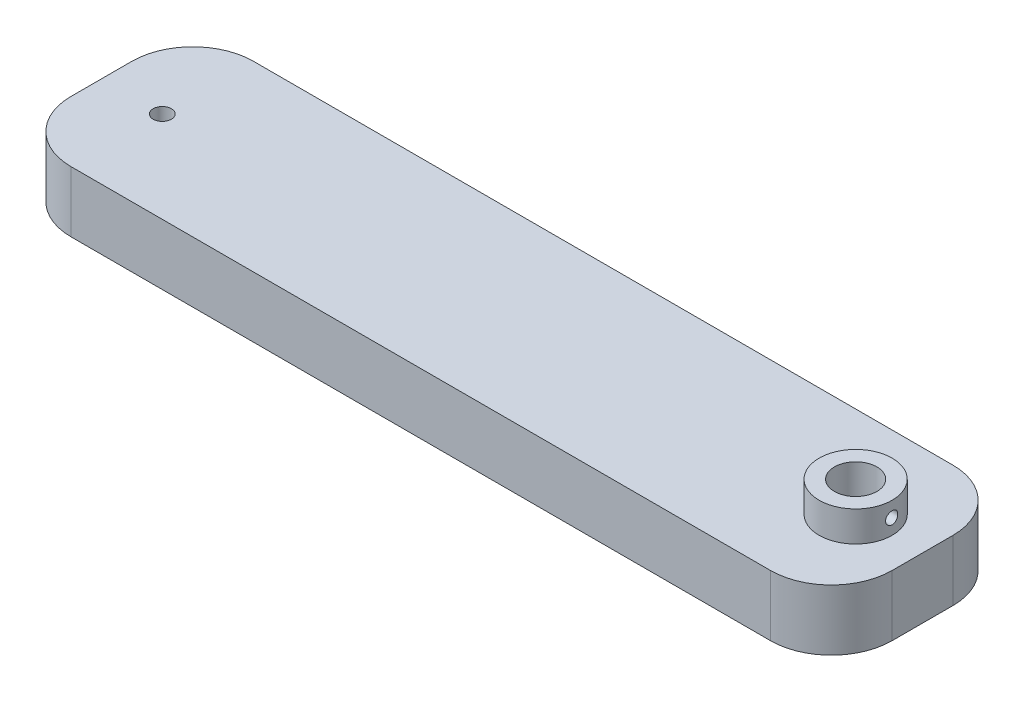
ISO-10303-21;
HEADER;
FILE_DESCRIPTION(('STEP AP214'),'2;1');
FILE_NAME('part.step','',(''),(''),'','','');
FILE_SCHEMA(('AUTOMOTIVE_DESIGN { 1 0 10303 214 1 1 1 1 }'));
ENDSEC;
DATA;
#1=APPLICATION_CONTEXT('core data for automotive mechanical design processes');
#2=APPLICATION_PROTOCOL_DEFINITION('international standard','automotive_design',2000,#1);
#3=PRODUCT_CONTEXT('',#1,'mechanical');
#4=PRODUCT('Part','Part','',(#3));
#5=PRODUCT_RELATED_PRODUCT_CATEGORY('part','',(#4));
#6=PRODUCT_DEFINITION_FORMATION('','',#4);
#7=PRODUCT_DEFINITION_CONTEXT('part definition',#1,'design');
#8=PRODUCT_DEFINITION('design','',#6,#7);
#9=PRODUCT_DEFINITION_SHAPE('','',#8);
#10=(LENGTH_UNIT() NAMED_UNIT(*) SI_UNIT(.MILLI.,.METRE.));
#11=(NAMED_UNIT(*) PLANE_ANGLE_UNIT() SI_UNIT($,.RADIAN.));
#12=(NAMED_UNIT(*) SI_UNIT($,.STERADIAN.) SOLID_ANGLE_UNIT());
#13=UNCERTAINTY_MEASURE_WITH_UNIT(LENGTH_MEASURE(1.E-05),#10,'distance_accuracy_value','');
#14=(GEOMETRIC_REPRESENTATION_CONTEXT(3) GLOBAL_UNCERTAINTY_ASSIGNED_CONTEXT((#13)) GLOBAL_UNIT_ASSIGNED_CONTEXT((#10,
#11,#12)) REPRESENTATION_CONTEXT('',''));
#15=CARTESIAN_POINT('',(0.,0.,0.));
#16=DIRECTION('',(0.,0.,1.));
#17=DIRECTION('',(1.,0.,0.));
#18=AXIS2_PLACEMENT_3D('',#15,#16,#17);
#19=CARTESIAN_POINT('',(56.5,0.,0.));
#20=DIRECTION('',(0.,1.,0.));
#21=DIRECTION('',(0.,0.,1.));
#22=AXIS2_PLACEMENT_3D('',#19,#20,#21);
#23=CYLINDRICAL_SURFACE('',#22,3.50000000000001);
#24=CARTESIAN_POINT('',(56.5,0.,0.));
#25=DIRECTION('',(0.,1.,0.));
#26=DIRECTION('',(0.,0.,1.));
#27=AXIS2_PLACEMENT_3D('',#24,#25,#26);
#28=CIRCLE('',#27,3.50000000000001);
#29=CARTESIAN_POINT('',(56.5,0.,3.49999999999999));
#30=VERTEX_POINT('',#29);
#31=EDGE_CURVE('E185',#30,#30,#28,.T.);
#32=ORIENTED_EDGE('',*,*,#31,.F.);
#33=EDGE_LOOP('',(#32));
#34=FACE_BOUND('',#33,.T.);
#35=CARTESIAN_POINT('',(56.5,15.,0.));
#36=DIRECTION('',(0.,1.,0.));
#37=DIRECTION('',(0.,0.,1.));
#38=AXIS2_PLACEMENT_3D('',#35,#36,#37);
#39=CIRCLE('',#38,3.5);
#40=CARTESIAN_POINT('',(56.5,15.,3.49999999999998));
#41=VERTEX_POINT('',#40);
#42=EDGE_CURVE('E201',#41,#41,#39,.T.);
#43=ORIENTED_EDGE('',*,*,#42,.T.);
#44=EDGE_LOOP('',(#43));
#45=FACE_BOUND('',#44,.T.);
#46=CARTESIAN_POINT('',(59.8541019662497,12.5,0.999999999999987));
#47=CARTESIAN_POINT('',(59.8541027352982,12.5549257689228,0.999999010234605));
#48=CARTESIAN_POINT('',(59.8554658993723,12.6098615420798,0.99545933300938));
#49=CARTESIAN_POINT('',(59.8607519470192,12.7181356193876,0.977461816962135));
#50=CARTESIAN_POINT('',(59.8646758717462,12.7714732645416,0.964000350683286));
#51=CARTESIAN_POINT('',(59.874603547345,12.8749686004512,0.928646716460396));
#52=CARTESIAN_POINT('',(59.8806040762164,12.9251310759127,0.906767603258306));
#53=CARTESIAN_POINT('',(59.8940046055512,13.021083905773,0.855241820315728));
#54=CARTESIAN_POINT('',(59.9014047721451,13.0668737401879,0.825594228332006));
#55=CARTESIAN_POINT('',(59.9170089160512,13.1540957826586,0.75846240049069));
#56=CARTESIAN_POINT('',(59.9252287798155,13.1953839010649,0.720794605566158));
#57=CARTESIAN_POINT('',(59.9414098275654,13.2711513916516,0.639085622734702));
#58=CARTESIAN_POINT('',(59.9493709811697,13.3056299665613,0.595043689579826));
#59=CARTESIAN_POINT('',(59.9643166600061,13.3674143241768,0.500823016078763));
#60=CARTESIAN_POINT('',(59.971280272504,13.3945748098755,0.450545391880917));
#61=CARTESIAN_POINT('',(59.9832627024281,13.440000887208,0.345904237619814));
#62=CARTESIAN_POINT('',(59.9882818984544,13.4582682106201,0.291541505437576));
#63=CARTESIAN_POINT('',(59.9956975965011,13.4849172306199,0.181779287560575));
#64=CARTESIAN_POINT('',(59.9981591350565,13.4935445108523,0.126443899064507));
#65=CARTESIAN_POINT('',(60.0004104782985,13.5014433669416,0.0150600512109498));
#66=CARTESIAN_POINT('',(60.0002007936949,13.5007167311687,-0.0409882697942867));
#67=CARTESIAN_POINT('',(59.9971800338165,13.490096812541,-0.150490097867623));
#68=CARTESIAN_POINT('',(59.9944443538803,13.480469193681,-0.203971773054485));
#69=CARTESIAN_POINT('',(59.9867694316507,13.4527524487678,-0.308526111088821));
#70=CARTESIAN_POINT('',(59.9818300552811,13.4346628078689,-0.359598627150267));
#71=CARTESIAN_POINT('',(59.9701951588606,13.3903452995941,-0.458536916864474));
#72=CARTESIAN_POINT('',(59.9634810275609,13.3640306110958,-0.506361521925399));
#73=CARTESIAN_POINT('',(59.94901384487,13.304077706801,-0.597003621795254));
#74=CARTESIAN_POINT('',(59.9412605659588,13.2704378861668,-0.639820016208017));
#75=CARTESIAN_POINT('',(59.9252284150991,13.1953971446907,-0.720816324273889));
#76=CARTESIAN_POINT('',(59.9169406468508,13.1537652831974,-0.758780788792465));
#77=CARTESIAN_POINT('',(59.9010148689311,13.0646424540771,-0.827246507874889));
#78=CARTESIAN_POINT('',(59.8933769120124,13.0171510115256,-0.8577471568913));
#79=CARTESIAN_POINT('',(59.8795758740866,12.9171345577509,-0.910616679927268));
#80=CARTESIAN_POINT('',(59.8734250547477,12.8645723874737,-0.932918688943938));
#81=CARTESIAN_POINT('',(59.8634427218823,12.7562234182481,-0.968294757480393));
#82=CARTESIAN_POINT('',(59.8596105335645,12.7004375626717,-0.981371502013303));
#83=CARTESIAN_POINT('',(59.8548455761775,12.5892597878381,-0.997537085998839));
#84=CARTESIAN_POINT('',(59.8538185573045,12.5339190915396,-1.00095074078697));
#85=CARTESIAN_POINT('',(59.8545207987023,12.4234558420425,-0.998594983598467));
#86=CARTESIAN_POINT('',(59.8562497151534,12.3683332624927,-0.992826717122498));
#87=CARTESIAN_POINT('',(59.8621771500827,12.2611793859847,-0.972558907129303));
#88=CARTESIAN_POINT('',(59.8663182147774,12.2091062069914,-0.958262310920621));
#89=CARTESIAN_POINT('',(59.8765453197035,12.1080990640022,-0.921575809332255));
#90=CARTESIAN_POINT('',(59.8826316405692,12.0591655541775,-0.89918473613388));
#91=CARTESIAN_POINT('',(59.8962509400331,11.9644889623913,-0.846309825608104));
#92=CARTESIAN_POINT('',(59.9038159869019,11.9188547778988,-0.815639458645662));
#93=CARTESIAN_POINT('',(59.9194686327529,11.8332618132784,-0.747302318424226));
#94=CARTESIAN_POINT('',(59.9275563447391,11.793304266494,-0.709634028840698));
#95=CARTESIAN_POINT('',(59.9436736371794,11.7188102908559,-0.626854004982789));
#96=CARTESIAN_POINT('',(59.9516920302304,11.6845025142906,-0.581533855120285));
#97=CARTESIAN_POINT('',(59.9664898852303,11.6239771593086,-0.485592653528785));
#98=CARTESIAN_POINT('',(59.9732694119271,11.5977591580388,-0.434971879049104));
#99=CARTESIAN_POINT('',(59.984782524232,11.5544078564868,-0.330216636478095));
#100=CARTESIAN_POINT('',(59.9895315406362,11.5372058052069,-0.27611239994983));
#101=CARTESIAN_POINT('',(59.9965166981194,11.5121865990299,-0.165622824274974));
#102=CARTESIAN_POINT('',(59.9987534856151,11.5043670299093,-0.109238075792732));
#103=CARTESIAN_POINT('',(60.0004266750164,11.4985042830011,0.00208911897950197));
#104=CARTESIAN_POINT('',(59.999958517945,11.5001279254586,0.0570128155249659));
#105=CARTESIAN_POINT('',(59.9964953456107,11.5123191407051,0.16577258621099));
#106=CARTESIAN_POINT('',(59.993500451353,11.522886285191,0.219608712308753));
#107=CARTESIAN_POINT('',(59.9853440093006,11.5524656804894,0.324202066519781));
#108=CARTESIAN_POINT('',(59.9802020702409,11.571401589472,0.374982516717513));
#109=CARTESIAN_POINT('',(59.9682854707172,11.6171130791427,0.472673601380719));
#110=CARTESIAN_POINT('',(59.9615105575088,11.6438898735461,0.519583635290327));
#111=CARTESIAN_POINT('',(59.946794777201,11.7054486687124,0.609716728176943));
#112=CARTESIAN_POINT('',(59.9388252289315,11.7404450433942,0.652788664003526));
#113=CARTESIAN_POINT('',(59.9227203249323,11.817054562727,0.732560611159176));
#114=CARTESIAN_POINT('',(59.9145849239342,11.8586695355425,0.769258856094875));
#115=CARTESIAN_POINT('',(59.8988201877208,11.9486484584977,0.836204230145631));
#116=CARTESIAN_POINT('',(59.8912097588478,11.9971609737516,0.866256583618012));
#117=CARTESIAN_POINT('',(59.8776422266528,12.0987609326575,0.917739718098026));
#118=CARTESIAN_POINT('',(59.8716841985791,12.1518457955448,0.939175324424076));
#119=CARTESIAN_POINT('',(59.8627922978003,12.2538268501158,0.970492670062508));
#120=CARTESIAN_POINT('',(59.8595621942308,12.3023451740493,0.981529499909252));
#121=CARTESIAN_POINT('',(59.8552168472718,12.400573059178,0.996283035217816));
#122=CARTESIAN_POINT('',(59.8541012701243,12.450282431123,1.00000089591332));
#123=CARTESIAN_POINT('',(59.8541019662497,12.5,0.999999999999987));
#124=B_SPLINE_CURVE_WITH_KNOTS('',3,(#46,#47,#48,#49,#50,#51,#52,#53,#54,#55,#56,#57,#58,#59,
#60,#61,#62,#63,#64,#65,#66,#67,#68,#69,#70,#71,#72,#73,#74,#75,#76,#77,#78,#79,#80,#81,#82,#83,
#84,#85,#86,#87,#88,#89,#90,#91,#92,#93,#94,#95,#96,#97,#98,#99,#100,#101,#102,#103,#104,#105,
#106,#107,#108,#109,#110,#111,#112,#113,#114,#115,#116,#117,#118,#119,#120,#121,#122,#123),
.UNSPECIFIED.,.T.,.F.,(4,2,2,2,2,2,2,2,2,2,2,2,2,2,2,2,2,2,2,2,2,2,2,2,2,2,2,2,2,2,2,2,2,2,2,2,
2,2,4),(0.,0.164594171159103,0.32925530476515,0.493662091823938,0.658088405459391,
0.826785835988799,0.995503006148131,1.16735741502495,1.33917834504425,1.50651450509943,
1.67381867271781,1.83628518817283,1.99876158968833,2.16301451684817,2.3273034658799,
2.49735806342072,2.66742645310452,2.83885260310575,3.01022883892078,3.17577181660545,
3.34129414341278,3.50302644820309,3.66478209600074,3.83054003013245,3.99633392302106,
4.16772694180382,4.33911100034377,4.50916842641098,4.67918208530373,4.84323448834084,
5.00727903537341,5.16985706186659,5.33246026763665,5.4998988436474,5.66738374949711,
5.83926806202707,6.01105598599879,6.160066444253,6.30905338065554),.UNSPECIFIED.);
#125=CARTESIAN_POINT('',(59.8541019662497,12.5,0.999999999999987));
#126=VERTEX_POINT('',#125);
#127=EDGE_CURVE('E206',#126,#126,#124,.T.);
#128=ORIENTED_EDGE('',*,*,#127,.F.);
#129=EDGE_LOOP('',(#128));
#130=FACE_BOUND('',#129,.T.);
#131=ADVANCED_FACE('F37',(#34,#45,#130),#23,.F.);
#132=CARTESIAN_POINT('',(56.5,15.,0.));
#133=DIRECTION('',(0.,-1.,0.));
#134=DIRECTION('',(0.,0.,-1.));
#135=AXIS2_PLACEMENT_3D('',#132,#133,#134);
#136=CYLINDRICAL_SURFACE('',#135,5.99999999999999);
#137=CARTESIAN_POINT('',(56.5,15.,0.));
#138=DIRECTION('',(0.,1.,0.));
#139=DIRECTION('',(0.,0.,1.));
#140=AXIS2_PLACEMENT_3D('',#137,#138,#139);
#141=CIRCLE('',#140,5.99999999999999);
#142=CARTESIAN_POINT('',(56.5,15.,5.99999999999997));
#143=VERTEX_POINT('',#142);
#144=EDGE_CURVE('E200',#143,#143,#141,.T.);
#145=ORIENTED_EDGE('',*,*,#144,.F.);
#146=EDGE_LOOP('',(#145));
#147=FACE_BOUND('',#146,.T.);
#148=CARTESIAN_POINT('',(56.5,10.,0.));
#149=DIRECTION('',(0.,1.,0.));
#150=DIRECTION('',(0.,0.,1.));
#151=AXIS2_PLACEMENT_3D('',#148,#149,#150);
#152=CIRCLE('',#151,5.99999999999999);
#153=CARTESIAN_POINT('',(56.5,10.,5.99999999999997));
#154=VERTEX_POINT('',#153);
#155=EDGE_CURVE('E197',#154,#154,#152,.T.);
#156=ORIENTED_EDGE('',*,*,#155,.T.);
#157=EDGE_LOOP('',(#156));
#158=FACE_BOUND('',#157,.T.);
#159=CARTESIAN_POINT('',(62.5,11.5,0.));
#160=CARTESIAN_POINT('',(62.4999990446753,11.5000022355791,-0.0557563619833066));
#161=CARTESIAN_POINT('',(62.4992147116521,11.5046789099876,-0.111543152735549));
#162=CARTESIAN_POINT('',(62.4961613797655,11.5232542635061,-0.221552088669237));
#163=CARTESIAN_POINT('',(62.4938910156956,11.5371614227646,-0.275772747183719));
#164=CARTESIAN_POINT('',(62.4881202729458,11.5737661794371,-0.381041898885077));
#165=CARTESIAN_POINT('',(62.4846209006368,11.5964565862562,-0.432092947372779));
#166=CARTESIAN_POINT('',(62.4767769083283,11.649964916821,-0.529656736791196));
#167=CARTESIAN_POINT('',(62.4724323850177,11.6807819109932,-0.576169995951455));
#168=CARTESIAN_POINT('',(62.4633332698332,11.7499820335282,-0.66378904571669));
#169=CARTESIAN_POINT('',(62.4585754872594,11.7884276458545,-0.704845161414004));
#170=CARTESIAN_POINT('',(62.4492105075069,11.8716591873891,-0.779955399463988));
#171=CARTESIAN_POINT('',(62.4446033198507,11.9164455165826,-0.814009079756406));
#172=CARTESIAN_POINT('',(62.4360302630391,12.0114283864788,-0.87434685024207));
#173=CARTESIAN_POINT('',(62.4320685163665,12.0616565347219,-0.900581821144417));
#174=CARTESIAN_POINT('',(62.4252791591787,12.1658838257203,-0.944223346164503));
#175=CARTESIAN_POINT('',(62.4224514720572,12.2198827134711,-0.961630496626261));
#176=CARTESIAN_POINT('',(62.418282147371,12.3295921099426,-0.986965751113938));
#177=CARTESIAN_POINT('',(62.4169270739428,12.3852822946006,-0.994979611654175));
#178=CARTESIAN_POINT('',(62.4158157557466,12.4972321107534,-1.00156669011596));
#179=CARTESIAN_POINT('',(62.4160593978288,12.5534917016669,-1.00014057615561));
#180=CARTESIAN_POINT('',(62.4181057154542,12.6643711445102,-0.987958039358473));
#181=CARTESIAN_POINT('',(62.4198922932757,12.7190019214181,-0.977297952755921));
#182=CARTESIAN_POINT('',(62.424797980844,12.8256885271317,-0.947101256161389));
#183=CARTESIAN_POINT('',(62.4279171362931,12.8777442675554,-0.927564341727907));
#184=CARTESIAN_POINT('',(62.4351539173364,12.9780915293764,-0.880070898437575));
#185=CARTESIAN_POINT('',(62.4392762684293,13.0263637624325,-0.852074365551896));
#186=CARTESIAN_POINT('',(62.44805167366,13.1175617602154,-0.788484807022983));
#187=CARTESIAN_POINT('',(62.4527047706171,13.160487092982,-0.752891168261724));
#188=CARTESIAN_POINT('',(62.4620881115191,13.2403304343229,-0.67459288486363));
#189=CARTESIAN_POINT('',(62.4668185969266,13.277167407416,-0.631805585549259));
#190=CARTESIAN_POINT('',(62.4757704055869,13.3431511050661,-0.540614099592666));
#191=CARTESIAN_POINT('',(62.479991725559,13.3722977800733,-0.492209876762576));
#192=CARTESIAN_POINT('',(62.4874555715717,13.4220808908545,-0.391082366466691));
#193=CARTESIAN_POINT('',(62.4906972736298,13.4427101677325,-0.338355490225871));
#194=CARTESIAN_POINT('',(62.4958300120506,13.4747976860984,-0.230119338241099));
#195=CARTESIAN_POINT('',(62.4977211614019,13.4862566947895,-0.174610295671794));
#196=CARTESIAN_POINT('',(62.4999245193707,13.4995685433845,-0.063083960520657));
#197=CARTESIAN_POINT('',(62.5002550120511,13.5015326287222,-0.00708029486041192));
#198=CARTESIAN_POINT('',(62.4993498976847,13.4960954622287,0.104455909155948));
#199=CARTESIAN_POINT('',(62.4981143508965,13.4886945707465,0.159988465556809));
#200=CARTESIAN_POINT('',(62.4942273077528,13.4648300602658,0.268662470218698));
#201=CARTESIAN_POINT('',(62.4915844192052,13.448421516644,0.321816347354144));
#202=CARTESIAN_POINT('',(62.4851778578214,13.4070661927202,0.424618753944169));
#203=CARTESIAN_POINT('',(62.4814141220481,13.3821189329459,0.47426708636388));
#204=CARTESIAN_POINT('',(62.4731380652096,13.3241395501213,0.569132275787575));
#205=CARTESIAN_POINT('',(62.4686194235481,13.2910379375331,0.61430610037485));
#206=CARTESIAN_POINT('',(62.4593538695676,13.217785073846,0.698497434201066));
#207=CARTESIAN_POINT('',(62.4546069406862,13.1776333106893,0.737514495878624));
#208=CARTESIAN_POINT('',(62.4453607009434,13.0909209807714,0.808697111863191));
#209=CARTESIAN_POINT('',(62.4408644645484,13.0442983337942,0.840787504445477));
#210=CARTESIAN_POINT('',(62.4326861191115,12.9462588123446,0.896680924117985));
#211=CARTESIAN_POINT('',(62.4290039842641,12.894842089909,0.920484213907919));
#212=CARTESIAN_POINT('',(62.4228938147908,12.7888841068751,0.959015332589249));
#213=CARTESIAN_POINT('',(62.4204606172443,12.7343567619878,0.973780573019167));
#214=CARTESIAN_POINT('',(62.417110867341,12.6235519483113,0.993934181511299));
#215=CARTESIAN_POINT('',(62.4161941831309,12.5672746321072,0.999323364778455));
#216=CARTESIAN_POINT('',(62.415986932336,12.455317933615,1.00054914641893));
#217=CARTESIAN_POINT('',(62.4166762260226,12.3996398485699,0.996504054450062));
#218=CARTESIAN_POINT('',(62.4195591258149,12.2897683007797,0.979231935582726));
#219=CARTESIAN_POINT('',(62.4217527270449,12.2355748332232,0.966004938444977));
#220=CARTESIAN_POINT('',(62.4273894251269,12.130256625083,0.930789795837946));
#221=CARTESIAN_POINT('',(62.4308310688787,12.0791283959776,0.908811836240162));
#222=CARTESIAN_POINT('',(62.4385774756888,11.9812657323221,0.856730801566348));
#223=CARTESIAN_POINT('',(62.4428822815536,11.9345315158511,0.826627323499409));
#224=CARTESIAN_POINT('',(62.4519338161825,11.8461857667569,0.758727553748845));
#225=CARTESIAN_POINT('',(62.4566851823052,11.8046415933199,0.720844225437442));
#226=CARTESIAN_POINT('',(62.4660574894434,11.72845935821,0.638643612552074));
#227=CARTESIAN_POINT('',(62.4706784001062,11.6938228925447,0.594324845165036));
#228=CARTESIAN_POINT('',(62.4793061185689,11.63222069272,0.500147667856094));
#229=CARTESIAN_POINT('',(62.4833084650124,11.6053095842748,0.450253115013109));
#230=CARTESIAN_POINT('',(62.4902046704071,11.560292206156,0.346605227751574));
#231=CARTESIAN_POINT('',(62.4930996327099,11.5421771675681,0.292855797931986));
#232=CARTESIAN_POINT('',(62.4968231633318,11.5191978903493,0.199081324018142));
#233=CARTESIAN_POINT('',(62.4980081090934,11.5120102121536,0.15962353211936));
#234=CARTESIAN_POINT('',(62.4995968639445,11.5024105048621,0.080115724127904));
#235=CARTESIAN_POINT('',(62.5000006864826,11.4999983935451,0.0400657182433774));
#236=CARTESIAN_POINT('',(62.5,11.5,0.));
#237=B_SPLINE_CURVE_WITH_KNOTS('',3,(#159,#160,#161,#162,#163,#164,#165,#166,#167,#168,#169,
#170,#171,#172,#173,#174,#175,#176,#177,#178,#179,#180,#181,#182,#183,#184,#185,#186,#187,#188,
#189,#190,#191,#192,#193,#194,#195,#196,#197,#198,#199,#200,#201,#202,#203,#204,#205,#206,#207,
#208,#209,#210,#211,#212,#213,#214,#215,#216,#217,#218,#219,#220,#221,#222,#223,#224,#225,#226,
#227,#228,#229,#230,#231,#232,#233,#234,#235,#236),.UNSPECIFIED.,.T.,.F.,(4,2,2,2,2,2,2,2,2,2,2,
2,2,2,2,2,2,2,2,2,2,2,2,2,2,2,2,2,2,2,2,2,2,2,2,2,2,2,4),(0.,0.167122633975404,
0.334399018278168,0.501538746810108,0.668659365069915,0.837209964249326,1.00577120067943,
1.17537008329536,1.34495750750473,1.51298430841369,1.68099921728355,1.84728208704163,
2.01357066010152,2.18065822653023,2.34775928272229,2.51693107964531,2.68610396654339,
2.85541875566361,3.02471937808459,3.19203153396559,3.35933725214344,3.52563122802566,
3.69193454330427,3.85970730250809,4.02749225221713,4.19701528803048,4.36653294950377,
4.53534408936709,4.70414055114647,4.8708316380908,5.03752218475253,5.20401927290489,
5.37052462011734,5.53900553677357,5.70752533551589,5.8772089264288,6.04672300852029,
6.16681699265607,6.28690890910787),.UNSPECIFIED.);
#238=CARTESIAN_POINT('',(62.5,11.5,0.));
#239=VERTEX_POINT('',#238);
#240=EDGE_CURVE('E11',#239,#239,#237,.T.);
#241=ORIENTED_EDGE('',*,*,#240,.F.);
#242=EDGE_LOOP('',(#241));
#243=FACE_BOUND('',#242,.T.);
#244=ADVANCED_FACE('F225',(#147,#158,#243),#136,.T.);
#245=CARTESIAN_POINT('',(0.,10.,0.));
#246=DIRECTION('',(0.,1.,0.));
#247=DIRECTION('',(0.,0.,1.));
#248=AXIS2_PLACEMENT_3D('',#245,#246,#247);
#249=PLANE('',#248);
#250=DIRECTION('',(1.,0.,0.));
#251=VECTOR('',#250,1.);
#252=CARTESIAN_POINT('',(67.5,10.,15.));
#253=LINE('',#252,#251);
#254=CARTESIAN_POINT('',(-57.5,10.,15.));
#255=VERTEX_POINT('',#254);
#256=CARTESIAN_POINT('',(57.5,10.,15.));
#257=VERTEX_POINT('',#256);
#258=EDGE_CURVE('E180',#255,#257,#253,.T.);
#259=ORIENTED_EDGE('',*,*,#258,.T.);
#260=CARTESIAN_POINT('',(57.5,10.,4.99999999999999));
#261=DIRECTION('',(0.,1.,0.));
#262=DIRECTION('',(0.,0.,1.));
#263=AXIS2_PLACEMENT_3D('',#260,#261,#262);
#264=CIRCLE('',#263,10.);
#265=CARTESIAN_POINT('',(67.5,10.,4.99999999999999));
#266=VERTEX_POINT('',#265);
#267=EDGE_CURVE('E156',#257,#266,#264,.T.);
#268=ORIENTED_EDGE('',*,*,#267,.T.);
#269=DIRECTION('',(0.,0.,-1.));
#270=VECTOR('',#269,1.);
#271=CARTESIAN_POINT('',(67.5,10.,15.));
#272=LINE('',#271,#270);
#273=CARTESIAN_POINT('',(67.5,10.,-5.00000000000001));
#274=VERTEX_POINT('',#273);
#275=EDGE_CURVE('E127',#266,#274,#272,.T.);
#276=ORIENTED_EDGE('',*,*,#275,.T.);
#277=CARTESIAN_POINT('',(57.5,10.,-5.00000000000001));
#278=DIRECTION('',(0.,1.,0.));
#279=DIRECTION('',(0.,0.,1.));
#280=AXIS2_PLACEMENT_3D('',#277,#278,#279);
#281=CIRCLE('',#280,10.);
#282=CARTESIAN_POINT('',(57.5,10.,-15.));
#283=VERTEX_POINT('',#282);
#284=EDGE_CURVE('E63',#274,#283,#281,.T.);
#285=ORIENTED_EDGE('',*,*,#284,.T.);
#286=DIRECTION('',(-1.,0.,0.));
#287=VECTOR('',#286,1.);
#288=CARTESIAN_POINT('',(67.5,10.,-15.));
#289=LINE('',#288,#287);
#290=CARTESIAN_POINT('',(-57.5,10.,-15.));
#291=VERTEX_POINT('',#290);
#292=EDGE_CURVE('E142',#283,#291,#289,.T.);
#293=ORIENTED_EDGE('',*,*,#292,.T.);
#294=CARTESIAN_POINT('',(-57.5,10.,-4.99999999999999));
#295=DIRECTION('',(0.,1.,0.));
#296=DIRECTION('',(0.,0.,1.));
#297=AXIS2_PLACEMENT_3D('',#294,#295,#296);
#298=CIRCLE('',#297,10.);
#299=CARTESIAN_POINT('',(-67.5,10.,-4.99999999999999));
#300=VERTEX_POINT('',#299);
#301=EDGE_CURVE('E152',#291,#300,#298,.T.);
#302=ORIENTED_EDGE('',*,*,#301,.T.);
#303=DIRECTION('',(0.,0.,1.));
#304=VECTOR('',#303,1.);
#305=CARTESIAN_POINT('',(-67.5,10.,15.));
#306=LINE('',#305,#304);
#307=CARTESIAN_POINT('',(-67.5,10.,5.));
#308=VERTEX_POINT('',#307);
#309=EDGE_CURVE('E136',#300,#308,#306,.T.);
#310=ORIENTED_EDGE('',*,*,#309,.T.);
#311=CARTESIAN_POINT('',(-57.5,10.,5.00000000000001));
#312=DIRECTION('',(0.,1.,0.));
#313=DIRECTION('',(0.,0.,1.));
#314=AXIS2_PLACEMENT_3D('',#311,#312,#313);
#315=CIRCLE('',#314,10.);
#316=EDGE_CURVE('E154',#308,#255,#315,.T.);
#317=ORIENTED_EDGE('',*,*,#316,.T.);
#318=EDGE_LOOP('',(#259,#268,#276,#285,#293,#302,#310,#317));
#319=FACE_BOUND('',#318,.T.);
#320=CARTESIAN_POINT('',(-57.5,10.,0.));
#321=DIRECTION('',(0.,1.,0.));
#322=DIRECTION('',(0.,0.,1.));
#323=AXIS2_PLACEMENT_3D('',#320,#321,#322);
#324=CIRCLE('',#323,1.5);
#325=CARTESIAN_POINT('',(-57.5,10.,1.49999999999998));
#326=VERTEX_POINT('',#325);
#327=EDGE_CURVE('E191',#326,#326,#324,.T.);
#328=ORIENTED_EDGE('',*,*,#327,.F.);
#329=EDGE_LOOP('',(#328));
#330=FACE_BOUND('',#329,.T.);
#331=ORIENTED_EDGE('',*,*,#155,.F.);
#332=EDGE_LOOP('',(#331));
#333=FACE_BOUND('',#332,.T.);
#334=ADVANCED_FACE('F228',(#319,#330,#333),#249,.T.);
#335=CARTESIAN_POINT('',(-67.5,10.,15.));
#336=DIRECTION('',(1.,0.,0.));
#337=DIRECTION('',(0.,0.,-1.));
#338=AXIS2_PLACEMENT_3D('',#335,#336,#337);
#339=PLANE('',#338);
#340=DIRECTION('',(0.,0.,1.));
#341=VECTOR('',#340,1.);
#342=CARTESIAN_POINT('',(-67.5,0.,15.));
#343=LINE('',#342,#341);
#344=CARTESIAN_POINT('',(-67.5,0.,-4.99999999999999));
#345=VERTEX_POINT('',#344);
#346=CARTESIAN_POINT('',(-67.5,0.,5.));
#347=VERTEX_POINT('',#346);
#348=EDGE_CURVE('E138',#345,#347,#343,.T.);
#349=ORIENTED_EDGE('',*,*,#348,.T.);
#350=DIRECTION('',(0.,-1.,0.));
#351=VECTOR('',#350,1.);
#352=CARTESIAN_POINT('',(-67.5,10.,5.));
#353=LINE('',#352,#351);
#354=EDGE_CURVE('E161',#347,#308,#353,.F.);
#355=ORIENTED_EDGE('',*,*,#354,.T.);
#356=ORIENTED_EDGE('',*,*,#309,.F.);
#357=DIRECTION('',(0.,-1.,0.));
#358=VECTOR('',#357,1.);
#359=CARTESIAN_POINT('',(-67.5,10.,-4.99999999999999));
#360=LINE('',#359,#358);
#361=EDGE_CURVE('E158',#300,#345,#360,.T.);
#362=ORIENTED_EDGE('',*,*,#361,.T.);
#363=EDGE_LOOP('',(#349,#355,#356,#362));
#364=FACE_BOUND('',#363,.T.);
#365=ADVANCED_FACE('F176',(#364),#339,.F.);
#366=CARTESIAN_POINT('',(67.5,10.,15.));
#367=DIRECTION('',(0.,0.,-1.));
#368=DIRECTION('',(-1.,0.,0.));
#369=AXIS2_PLACEMENT_3D('',#366,#367,#368);
#370=PLANE('',#369);
#371=DIRECTION('',(1.,0.,0.));
#372=VECTOR('',#371,1.);
#373=CARTESIAN_POINT('',(67.5,0.,15.));
#374=LINE('',#373,#372);
#375=CARTESIAN_POINT('',(-57.5,0.,15.));
#376=VERTEX_POINT('',#375);
#377=CARTESIAN_POINT('',(57.5,0.,15.));
#378=VERTEX_POINT('',#377);
#379=EDGE_CURVE('E134',#376,#378,#374,.T.);
#380=ORIENTED_EDGE('',*,*,#379,.T.);
#381=DIRECTION('',(0.,-1.,0.));
#382=VECTOR('',#381,1.);
#383=CARTESIAN_POINT('',(57.5,10.,15.));
#384=LINE('',#383,#382);
#385=EDGE_CURVE('E113',#378,#257,#384,.F.);
#386=ORIENTED_EDGE('',*,*,#385,.T.);
#387=ORIENTED_EDGE('',*,*,#258,.F.);
#388=DIRECTION('',(0.,-1.,0.));
#389=VECTOR('',#388,1.);
#390=CARTESIAN_POINT('',(-57.5,10.,15.));
#391=LINE('',#390,#389);
#392=EDGE_CURVE('E118',#255,#376,#391,.T.);
#393=ORIENTED_EDGE('',*,*,#392,.T.);
#394=EDGE_LOOP('',(#380,#386,#387,#393));
#395=FACE_BOUND('',#394,.T.);
#396=ADVANCED_FACE('F261',(#395),#370,.F.);
#397=CARTESIAN_POINT('',(67.5,10.,15.));
#398=DIRECTION('',(-1.,0.,0.));
#399=DIRECTION('',(0.,0.,1.));
#400=AXIS2_PLACEMENT_3D('',#397,#398,#399);
#401=PLANE('',#400);
#402=ORIENTED_EDGE('',*,*,#275,.F.);
#403=DIRECTION('',(0.,-1.,0.));
#404=VECTOR('',#403,1.);
#405=CARTESIAN_POINT('',(67.5,10.,4.99999999999999));
#406=LINE('',#405,#404);
#407=CARTESIAN_POINT('',(67.5,0.,4.99999999999999));
#408=VERTEX_POINT('',#407);
#409=EDGE_CURVE('E112',#266,#408,#406,.T.);
#410=ORIENTED_EDGE('',*,*,#409,.T.);
#411=DIRECTION('',(0.,0.,-1.));
#412=VECTOR('',#411,1.);
#413=CARTESIAN_POINT('',(67.5,0.,15.));
#414=LINE('',#413,#412);
#415=CARTESIAN_POINT('',(67.5,0.,-5.00000000000001));
#416=VERTEX_POINT('',#415);
#417=EDGE_CURVE('E125',#408,#416,#414,.T.);
#418=ORIENTED_EDGE('',*,*,#417,.T.);
#419=DIRECTION('',(0.,-1.,0.));
#420=VECTOR('',#419,1.);
#421=CARTESIAN_POINT('',(67.5,10.,-5.00000000000001));
#422=LINE('',#421,#420);
#423=EDGE_CURVE('E129',#416,#274,#422,.F.);
#424=ORIENTED_EDGE('',*,*,#423,.T.);
#425=EDGE_LOOP('',(#402,#410,#418,#424));
#426=FACE_BOUND('',#425,.T.);
#427=ADVANCED_FACE('F124',(#426),#401,.F.);
#428=CARTESIAN_POINT('',(67.5,10.,-15.));
#429=DIRECTION('',(0.,0.,1.));
#430=DIRECTION('',(1.,0.,0.));
#431=AXIS2_PLACEMENT_3D('',#428,#429,#430);
#432=PLANE('',#431);
#433=DIRECTION('',(-1.,0.,0.));
#434=VECTOR('',#433,1.);
#435=CARTESIAN_POINT('',(67.5,0.,-15.));
#436=LINE('',#435,#434);
#437=CARTESIAN_POINT('',(57.5,0.,-15.));
#438=VERTEX_POINT('',#437);
#439=CARTESIAN_POINT('',(-57.5,0.,-15.));
#440=VERTEX_POINT('',#439);
#441=EDGE_CURVE('E133',#438,#440,#436,.T.);
#442=ORIENTED_EDGE('',*,*,#441,.T.);
#443=DIRECTION('',(0.,-1.,0.));
#444=VECTOR('',#443,1.);
#445=CARTESIAN_POINT('',(-57.5,10.,-15.));
#446=LINE('',#445,#444);
#447=EDGE_CURVE('E50',#440,#291,#446,.F.);
#448=ORIENTED_EDGE('',*,*,#447,.T.);
#449=ORIENTED_EDGE('',*,*,#292,.F.);
#450=DIRECTION('',(0.,-1.,0.));
#451=VECTOR('',#450,1.);
#452=CARTESIAN_POINT('',(57.5,10.,-15.));
#453=LINE('',#452,#451);
#454=EDGE_CURVE('E163',#283,#438,#453,.T.);
#455=ORIENTED_EDGE('',*,*,#454,.T.);
#456=EDGE_LOOP('',(#442,#448,#449,#455));
#457=FACE_BOUND('',#456,.T.);
#458=ADVANCED_FACE('F166',(#457),#432,.F.);
#459=CARTESIAN_POINT('',(0.,0.,0.));
#460=DIRECTION('',(0.,1.,0.));
#461=DIRECTION('',(0.,0.,1.));
#462=AXIS2_PLACEMENT_3D('',#459,#460,#461);
#463=PLANE('',#462);
#464=CARTESIAN_POINT('',(-57.5,0.,0.));
#465=DIRECTION('',(0.,1.,0.));
#466=DIRECTION('',(0.,0.,1.));
#467=AXIS2_PLACEMENT_3D('',#464,#465,#466);
#468=CIRCLE('',#467,1.5);
#469=CARTESIAN_POINT('',(-57.5,0.,1.49999999999998));
#470=VERTEX_POINT('',#469);
#471=EDGE_CURVE('E189',#470,#470,#468,.T.);
#472=ORIENTED_EDGE('',*,*,#471,.T.);
#473=EDGE_LOOP('',(#472));
#474=FACE_BOUND('',#473,.T.);
#475=ORIENTED_EDGE('',*,*,#31,.T.);
#476=EDGE_LOOP('',(#475));
#477=FACE_BOUND('',#476,.T.);
#478=ORIENTED_EDGE('',*,*,#417,.F.);
#479=CARTESIAN_POINT('',(57.5,0.,4.99999999999999));
#480=DIRECTION('',(0.,1.,0.));
#481=DIRECTION('',(0.,0.,1.));
#482=AXIS2_PLACEMENT_3D('',#479,#480,#481);
#483=CIRCLE('',#482,10.);
#484=EDGE_CURVE('E108',#408,#378,#483,.F.);
#485=ORIENTED_EDGE('',*,*,#484,.T.);
#486=ORIENTED_EDGE('',*,*,#379,.F.);
#487=CARTESIAN_POINT('',(-57.5,0.,5.00000000000001));
#488=DIRECTION('',(0.,1.,0.));
#489=DIRECTION('',(0.,0.,1.));
#490=AXIS2_PLACEMENT_3D('',#487,#488,#489);
#491=CIRCLE('',#490,10.);
#492=EDGE_CURVE('E119',#376,#347,#491,.F.);
#493=ORIENTED_EDGE('',*,*,#492,.T.);
#494=ORIENTED_EDGE('',*,*,#348,.F.);
#495=CARTESIAN_POINT('',(-57.5,0.,-4.99999999999999));
#496=DIRECTION('',(0.,1.,0.));
#497=DIRECTION('',(0.,0.,1.));
#498=AXIS2_PLACEMENT_3D('',#495,#496,#497);
#499=CIRCLE('',#498,10.);
#500=EDGE_CURVE('E145',#345,#440,#499,.F.);
#501=ORIENTED_EDGE('',*,*,#500,.T.);
#502=ORIENTED_EDGE('',*,*,#441,.F.);
#503=CARTESIAN_POINT('',(57.5,0.,-5.00000000000001));
#504=DIRECTION('',(0.,1.,0.));
#505=DIRECTION('',(0.,0.,1.));
#506=AXIS2_PLACEMENT_3D('',#503,#504,#505);
#507=CIRCLE('',#506,10.);
#508=EDGE_CURVE('E128',#438,#416,#507,.F.);
#509=ORIENTED_EDGE('',*,*,#508,.T.);
#510=EDGE_LOOP('',(#478,#485,#486,#493,#494,#501,#502,#509));
#511=FACE_BOUND('',#510,.T.);
#512=ADVANCED_FACE('F131',(#474,#477,#511),#463,.F.);
#513=CARTESIAN_POINT('',(57.5,10.,4.99999999999999));
#514=DIRECTION('',(0.,-1.,0.));
#515=DIRECTION('',(0.,0.,-1.));
#516=AXIS2_PLACEMENT_3D('',#513,#514,#515);
#517=CYLINDRICAL_SURFACE('',#516,10.);
#518=ORIENTED_EDGE('',*,*,#267,.F.);
#519=ORIENTED_EDGE('',*,*,#385,.F.);
#520=ORIENTED_EDGE('',*,*,#484,.F.);
#521=ORIENTED_EDGE('',*,*,#409,.F.);
#522=EDGE_LOOP('',(#518,#519,#520,#521));
#523=FACE_BOUND('',#522,.T.);
#524=ADVANCED_FACE('F111',(#523),#517,.T.);
#525=CARTESIAN_POINT('',(-57.5,10.,5.00000000000001));
#526=DIRECTION('',(0.,-1.,0.));
#527=DIRECTION('',(0.,0.,-1.));
#528=AXIS2_PLACEMENT_3D('',#525,#526,#527);
#529=CYLINDRICAL_SURFACE('',#528,10.);
#530=ORIENTED_EDGE('',*,*,#316,.F.);
#531=ORIENTED_EDGE('',*,*,#354,.F.);
#532=ORIENTED_EDGE('',*,*,#492,.F.);
#533=ORIENTED_EDGE('',*,*,#392,.F.);
#534=EDGE_LOOP('',(#530,#531,#532,#533));
#535=FACE_BOUND('',#534,.T.);
#536=ADVANCED_FACE('F255',(#535),#529,.T.);
#537=CARTESIAN_POINT('',(-57.5,10.,-4.99999999999999));
#538=DIRECTION('',(0.,-1.,0.));
#539=DIRECTION('',(0.,0.,-1.));
#540=AXIS2_PLACEMENT_3D('',#537,#538,#539);
#541=CYLINDRICAL_SURFACE('',#540,10.);
#542=ORIENTED_EDGE('',*,*,#301,.F.);
#543=ORIENTED_EDGE('',*,*,#447,.F.);
#544=ORIENTED_EDGE('',*,*,#500,.F.);
#545=ORIENTED_EDGE('',*,*,#361,.F.);
#546=EDGE_LOOP('',(#542,#543,#544,#545));
#547=FACE_BOUND('',#546,.T.);
#548=ADVANCED_FACE('F173',(#547),#541,.T.);
#549=CARTESIAN_POINT('',(57.5,10.,-5.00000000000001));
#550=DIRECTION('',(0.,-1.,0.));
#551=DIRECTION('',(0.,0.,-1.));
#552=AXIS2_PLACEMENT_3D('',#549,#550,#551);
#553=CYLINDRICAL_SURFACE('',#552,10.);
#554=ORIENTED_EDGE('',*,*,#284,.F.);
#555=ORIENTED_EDGE('',*,*,#423,.F.);
#556=ORIENTED_EDGE('',*,*,#508,.F.);
#557=ORIENTED_EDGE('',*,*,#454,.F.);
#558=EDGE_LOOP('',(#554,#555,#556,#557));
#559=FACE_BOUND('',#558,.T.);
#560=ADVANCED_FACE('F39',(#559),#553,.T.);
#561=CARTESIAN_POINT('',(-57.5,0.,0.));
#562=DIRECTION('',(0.,1.,0.));
#563=DIRECTION('',(0.,0.,1.));
#564=AXIS2_PLACEMENT_3D('',#561,#562,#563);
#565=CYLINDRICAL_SURFACE('',#564,1.5);
#566=ORIENTED_EDGE('',*,*,#471,.F.);
#567=EDGE_LOOP('',(#566));
#568=FACE_BOUND('',#567,.T.);
#569=ORIENTED_EDGE('',*,*,#327,.T.);
#570=EDGE_LOOP('',(#569));
#571=FACE_BOUND('',#570,.T.);
#572=ADVANCED_FACE('F223',(#568,#571),#565,.F.);
#573=CARTESIAN_POINT('',(56.5,15.,0.));
#574=DIRECTION('',(0.,1.,0.));
#575=DIRECTION('',(0.,0.,1.));
#576=AXIS2_PLACEMENT_3D('',#573,#574,#575);
#577=PLANE('',#576);
#578=ORIENTED_EDGE('',*,*,#144,.T.);
#579=EDGE_LOOP('',(#578));
#580=FACE_BOUND('',#579,.T.);
#581=ORIENTED_EDGE('',*,*,#42,.F.);
#582=EDGE_LOOP('',(#581));
#583=FACE_BOUND('',#582,.T.);
#584=ADVANCED_FACE('F219',(#580,#583),#577,.T.);
#585=CARTESIAN_POINT('',(62.5,12.5,0.));
#586=DIRECTION('',(-1.,0.,0.));
#587=DIRECTION('',(0.,0.,1.));
#588=AXIS2_PLACEMENT_3D('',#585,#586,#587);
#589=CYLINDRICAL_SURFACE('',#588,1.);
#590=ORIENTED_EDGE('',*,*,#240,.T.);
#591=EDGE_LOOP('',(#590));
#592=FACE_BOUND('',#591,.T.);
#593=ORIENTED_EDGE('',*,*,#127,.T.);
#594=EDGE_LOOP('',(#593));
#595=FACE_BOUND('',#594,.T.);
#596=ADVANCED_FACE('F215',(#592,#595),#589,.F.);
#597=CLOSED_SHELL('',(#131,#244,#334,#365,#396,#427,#458,#512,#524,#536,#548,#560,#572,#584,#596));
#598=MANIFOLD_SOLID_BREP('B2',#597);
#599=ADVANCED_BREP_SHAPE_REPRESENTATION('',(#18,#598),#14);
#600=SHAPE_DEFINITION_REPRESENTATION(#9,#599);
ENDSEC;
END-ISO-10303-21;
